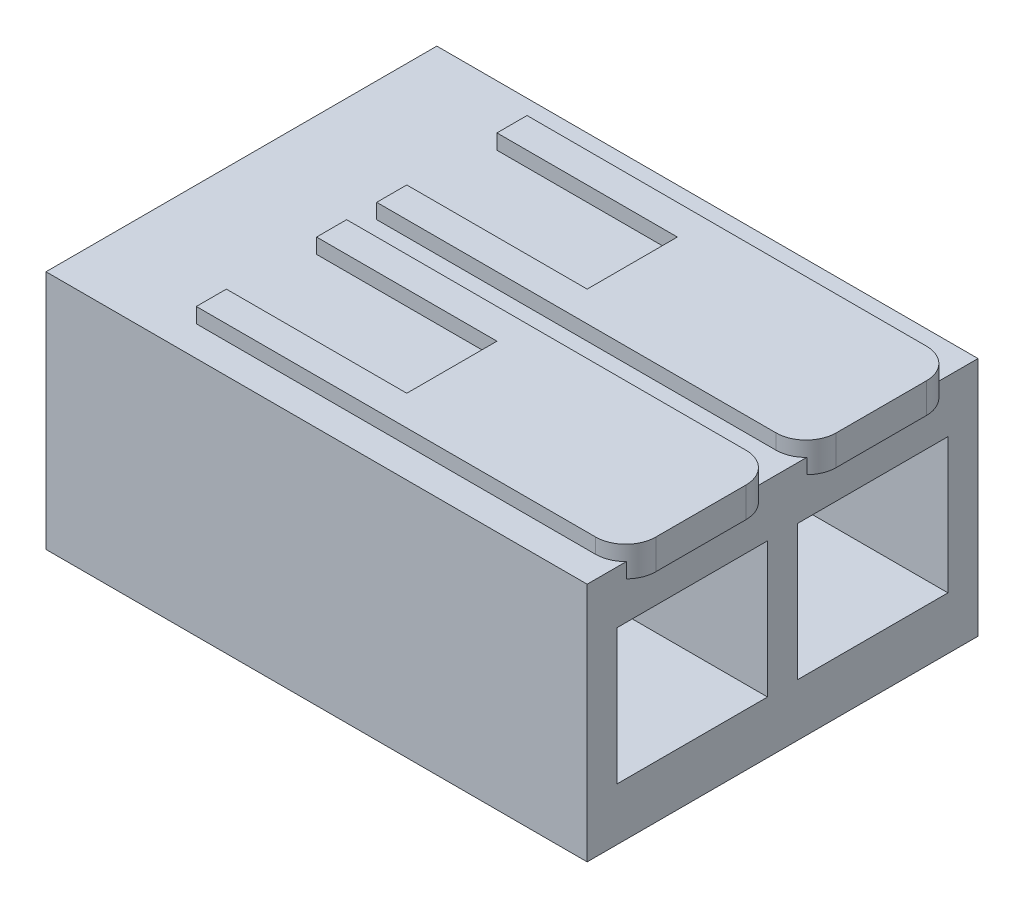
ISO-10303-21;
HEADER;
FILE_DESCRIPTION(('STEP AP214'),'2;1');
FILE_NAME('part.step','',(''),(''),'','','');
FILE_SCHEMA(('AUTOMOTIVE_DESIGN { 1 0 10303 214 1 1 1 1 }'));
ENDSEC;
DATA;
#1=APPLICATION_CONTEXT('core data for automotive mechanical design processes');
#2=APPLICATION_PROTOCOL_DEFINITION('international standard','automotive_design',2000,#1);
#3=PRODUCT_CONTEXT('',#1,'mechanical');
#4=PRODUCT('Part','Part','',(#3));
#5=PRODUCT_RELATED_PRODUCT_CATEGORY('part','',(#4));
#6=PRODUCT_DEFINITION_FORMATION('','',#4);
#7=PRODUCT_DEFINITION_CONTEXT('part definition',#1,'design');
#8=PRODUCT_DEFINITION('design','',#6,#7);
#9=PRODUCT_DEFINITION_SHAPE('','',#8);
#10=(LENGTH_UNIT() NAMED_UNIT(*) SI_UNIT(.MILLI.,.METRE.));
#11=(NAMED_UNIT(*) PLANE_ANGLE_UNIT() SI_UNIT($,.RADIAN.));
#12=(NAMED_UNIT(*) SI_UNIT($,.STERADIAN.) SOLID_ANGLE_UNIT());
#13=UNCERTAINTY_MEASURE_WITH_UNIT(LENGTH_MEASURE(1.E-05),#10,'distance_accuracy_value','');
#14=(GEOMETRIC_REPRESENTATION_CONTEXT(3) GLOBAL_UNCERTAINTY_ASSIGNED_CONTEXT((#13)) GLOBAL_UNIT_ASSIGNED_CONTEXT((#10,
#11,#12)) REPRESENTATION_CONTEXT('',''));
#15=CARTESIAN_POINT('',(0.,0.,0.));
#16=DIRECTION('',(0.,0.,1.));
#17=DIRECTION('',(1.,0.,0.));
#18=AXIS2_PLACEMENT_3D('',#15,#16,#17);
#19=CARTESIAN_POINT('',(4.,8.5,7.));
#20=DIRECTION('',(1.,0.,0.));
#21=DIRECTION('',(0.,1.,0.));
#22=AXIS2_PLACEMENT_3D('',#19,#20,#21);
#23=PLANE('',#22);
#24=DIRECTION('',(0.,0.,1.));
#25=VECTOR('',#24,1.);
#26=CARTESIAN_POINT('',(4.,7.5,7.));
#27=LINE('',#26,#25);
#28=CARTESIAN_POINT('',(4.,7.5,7.));
#29=VERTEX_POINT('',#28);
#30=CARTESIAN_POINT('',(4.,7.5,8.));
#31=VERTEX_POINT('',#30);
#32=EDGE_CURVE('E161',#29,#31,#27,.T.);
#33=ORIENTED_EDGE('',*,*,#32,.T.);
#34=DIRECTION('',(0.,-1.,0.));
#35=VECTOR('',#34,1.);
#36=CARTESIAN_POINT('',(4.,8.5,8.));
#37=LINE('',#36,#35);
#38=CARTESIAN_POINT('',(4.,8.5,8.));
#39=VERTEX_POINT('',#38);
#40=EDGE_CURVE('E12',#39,#31,#37,.T.);
#41=ORIENTED_EDGE('',*,*,#40,.F.);
#42=DIRECTION('',(0.,0.,1.));
#43=VECTOR('',#42,1.);
#44=CARTESIAN_POINT('',(4.,8.5,7.));
#45=LINE('',#44,#43);
#46=CARTESIAN_POINT('',(4.,8.5,7.));
#47=VERTEX_POINT('',#46);
#48=EDGE_CURVE('E179',#47,#39,#45,.T.);
#49=ORIENTED_EDGE('',*,*,#48,.F.);
#50=DIRECTION('',(0.,-1.,0.));
#51=VECTOR('',#50,1.);
#52=CARTESIAN_POINT('',(4.,8.5,7.));
#53=LINE('',#52,#51);
#54=EDGE_CURVE('E157',#47,#29,#53,.T.);
#55=ORIENTED_EDGE('',*,*,#54,.T.);
#56=EDGE_LOOP('',(#33,#41,#49,#55));
#57=FACE_BOUND('',#56,.T.);
#58=ADVANCED_FACE('F53',(#57),#23,.F.);
#59=CARTESIAN_POINT('',(4.,8.5,8.));
#60=DIRECTION('',(0.,0.,-1.));
#61=DIRECTION('',(-1.,0.,0.));
#62=AXIS2_PLACEMENT_3D('',#59,#60,#61);
#63=PLANE('',#62);
#64=DIRECTION('',(1.,0.,0.));
#65=VECTOR('',#64,1.);
#66=CARTESIAN_POINT('',(4.,7.5,8.));
#67=LINE('',#66,#65);
#68=CARTESIAN_POINT('',(10.,7.5,8.));
#69=VERTEX_POINT('',#68);
#70=EDGE_CURVE('E164',#31,#69,#67,.T.);
#71=ORIENTED_EDGE('',*,*,#70,.T.);
#72=DIRECTION('',(0.,-1.,0.));
#73=VECTOR('',#72,1.);
#74=CARTESIAN_POINT('',(10.,8.5,8.));
#75=LINE('',#74,#73);
#76=CARTESIAN_POINT('',(10.,8.5,8.));
#77=VERTEX_POINT('',#76);
#78=EDGE_CURVE('E61',#77,#69,#75,.T.);
#79=ORIENTED_EDGE('',*,*,#78,.F.);
#80=DIRECTION('',(1.,0.,0.));
#81=VECTOR('',#80,1.);
#82=CARTESIAN_POINT('',(4.,8.5,8.));
#83=LINE('',#82,#81);
#84=EDGE_CURVE('E118',#39,#77,#83,.T.);
#85=ORIENTED_EDGE('',*,*,#84,.F.);
#86=ORIENTED_EDGE('',*,*,#40,.T.);
#87=EDGE_LOOP('',(#71,#79,#85,#86));
#88=FACE_BOUND('',#87,.T.);
#89=ADVANCED_FACE('F228',(#88),#63,.F.);
#90=CARTESIAN_POINT('',(10.,8.5,8.));
#91=DIRECTION('',(1.,0.,0.));
#92=DIRECTION('',(0.,1.,0.));
#93=AXIS2_PLACEMENT_3D('',#90,#91,#92);
#94=PLANE('',#93);
#95=DIRECTION('',(0.,0.,1.));
#96=VECTOR('',#95,1.);
#97=CARTESIAN_POINT('',(10.,7.5,8.));
#98=LINE('',#97,#96);
#99=CARTESIAN_POINT('',(10.,7.5,11.));
#100=VERTEX_POINT('',#99);
#101=EDGE_CURVE('E166',#69,#100,#98,.T.);
#102=ORIENTED_EDGE('',*,*,#101,.T.);
#103=DIRECTION('',(0.,-1.,0.));
#104=VECTOR('',#103,1.);
#105=CARTESIAN_POINT('',(10.,8.5,11.));
#106=LINE('',#105,#104);
#107=CARTESIAN_POINT('',(10.,8.5,11.));
#108=VERTEX_POINT('',#107);
#109=EDGE_CURVE('E192',#108,#100,#106,.T.);
#110=ORIENTED_EDGE('',*,*,#109,.F.);
#111=DIRECTION('',(0.,0.,1.));
#112=VECTOR('',#111,1.);
#113=CARTESIAN_POINT('',(10.,8.5,8.));
#114=LINE('',#113,#112);
#115=EDGE_CURVE('E200',#77,#108,#114,.T.);
#116=ORIENTED_EDGE('',*,*,#115,.F.);
#117=ORIENTED_EDGE('',*,*,#78,.T.);
#118=EDGE_LOOP('',(#102,#110,#116,#117));
#119=FACE_BOUND('',#118,.T.);
#120=ADVANCED_FACE('F198',(#119),#94,.F.);
#121=CARTESIAN_POINT('',(10.,8.5,11.));
#122=DIRECTION('',(0.,0.,1.));
#123=DIRECTION('',(1.,0.,0.));
#124=AXIS2_PLACEMENT_3D('',#121,#122,#123);
#125=PLANE('',#124);
#126=DIRECTION('',(-1.,0.,0.));
#127=VECTOR('',#126,1.);
#128=CARTESIAN_POINT('',(10.,7.5,11.));
#129=LINE('',#128,#127);
#130=CARTESIAN_POINT('',(4.,7.5,11.));
#131=VERTEX_POINT('',#130);
#132=EDGE_CURVE('E168',#100,#131,#129,.T.);
#133=ORIENTED_EDGE('',*,*,#132,.T.);
#134=DIRECTION('',(0.,-1.,0.));
#135=VECTOR('',#134,1.);
#136=CARTESIAN_POINT('',(4.,8.5,11.));
#137=LINE('',#136,#135);
#138=CARTESIAN_POINT('',(4.,8.5,11.));
#139=VERTEX_POINT('',#138);
#140=EDGE_CURVE('E189',#139,#131,#137,.T.);
#141=ORIENTED_EDGE('',*,*,#140,.F.);
#142=DIRECTION('',(-1.,0.,0.));
#143=VECTOR('',#142,1.);
#144=CARTESIAN_POINT('',(10.,8.5,11.));
#145=LINE('',#144,#143);
#146=EDGE_CURVE('E218',#108,#139,#145,.T.);
#147=ORIENTED_EDGE('',*,*,#146,.F.);
#148=ORIENTED_EDGE('',*,*,#109,.T.);
#149=EDGE_LOOP('',(#133,#141,#147,#148));
#150=FACE_BOUND('',#149,.T.);
#151=ADVANCED_FACE('F209',(#150),#125,.F.);
#152=CARTESIAN_POINT('',(4.,8.5,11.));
#153=DIRECTION('',(1.,0.,0.));
#154=DIRECTION('',(0.,1.,0.));
#155=AXIS2_PLACEMENT_3D('',#152,#153,#154);
#156=PLANE('',#155);
#157=DIRECTION('',(0.,0.,1.));
#158=VECTOR('',#157,1.);
#159=CARTESIAN_POINT('',(4.,7.5,11.));
#160=LINE('',#159,#158);
#161=CARTESIAN_POINT('',(4.,7.5,12.));
#162=VERTEX_POINT('',#161);
#163=EDGE_CURVE('E170',#131,#162,#160,.T.);
#164=ORIENTED_EDGE('',*,*,#163,.T.);
#165=DIRECTION('',(0.,-1.,0.));
#166=VECTOR('',#165,1.);
#167=CARTESIAN_POINT('',(4.,8.5,12.));
#168=LINE('',#167,#166);
#169=CARTESIAN_POINT('',(4.,8.5,12.));
#170=VERTEX_POINT('',#169);
#171=EDGE_CURVE('E186',#170,#162,#168,.T.);
#172=ORIENTED_EDGE('',*,*,#171,.F.);
#173=DIRECTION('',(0.,0.,1.));
#174=VECTOR('',#173,1.);
#175=CARTESIAN_POINT('',(4.,8.5,11.));
#176=LINE('',#175,#174);
#177=EDGE_CURVE('E215',#139,#170,#176,.T.);
#178=ORIENTED_EDGE('',*,*,#177,.F.);
#179=ORIENTED_EDGE('',*,*,#140,.T.);
#180=EDGE_LOOP('',(#164,#172,#178,#179));
#181=FACE_BOUND('',#180,.T.);
#182=ADVANCED_FACE('F213',(#181),#156,.F.);
#183=CARTESIAN_POINT('',(4.,8.5,12.));
#184=DIRECTION('',(0.,0.,-1.));
#185=DIRECTION('',(-1.,0.,0.));
#186=AXIS2_PLACEMENT_3D('',#183,#184,#185);
#187=PLANE('',#186);
#188=DIRECTION('',(1.,0.,0.));
#189=VECTOR('',#188,1.);
#190=CARTESIAN_POINT('',(4.,7.5,12.));
#191=LINE('',#190,#189);
#192=CARTESIAN_POINT('',(17.2832005913522,7.5,12.));
#193=VERTEX_POINT('',#192);
#194=EDGE_CURVE('E172',#162,#193,#191,.T.);
#195=ORIENTED_EDGE('',*,*,#194,.T.);
#196=DIRECTION('',(0.,-1.,0.));
#197=VECTOR('',#196,1.);
#198=CARTESIAN_POINT('',(17.2832005913522,8.5,12.));
#199=LINE('',#198,#197);
#200=CARTESIAN_POINT('',(17.2832005913522,8.5,12.));
#201=VERTEX_POINT('',#200);
#202=EDGE_CURVE('E183',#201,#193,#199,.T.);
#203=ORIENTED_EDGE('',*,*,#202,.F.);
#204=DIRECTION('',(1.,0.,0.));
#205=VECTOR('',#204,1.);
#206=CARTESIAN_POINT('',(4.,8.5,12.));
#207=LINE('',#206,#205);
#208=EDGE_CURVE('E217',#170,#201,#207,.T.);
#209=ORIENTED_EDGE('',*,*,#208,.F.);
#210=ORIENTED_EDGE('',*,*,#171,.T.);
#211=EDGE_LOOP('',(#195,#203,#209,#210));
#212=FACE_BOUND('',#211,.T.);
#213=ADVANCED_FACE('F240',(#212),#187,.F.);
#214=CARTESIAN_POINT('',(17.2832005913522,8.5,11.));
#215=DIRECTION('',(0.,-1.,0.));
#216=DIRECTION('',(1.,0.,0.));
#217=AXIS2_PLACEMENT_3D('',#214,#215,#216);
#218=CYLINDRICAL_SURFACE('',#217,1.);
#219=CARTESIAN_POINT('',(17.2832005913522,7.5,11.));
#220=DIRECTION('',(0.,1.,0.));
#221=DIRECTION('',(-1.,0.,0.));
#222=AXIS2_PLACEMENT_3D('',#219,#220,#221);
#223=CIRCLE('',#222,1.);
#224=CARTESIAN_POINT('',(18.2832005913522,7.5,11.));
#225=VERTEX_POINT('',#224);
#226=EDGE_CURVE('E174',#193,#225,#223,.T.);
#227=ORIENTED_EDGE('',*,*,#226,.T.);
#228=DIRECTION('',(0.,-1.,0.));
#229=VECTOR('',#228,1.);
#230=CARTESIAN_POINT('',(18.2832005913522,8.5,11.));
#231=LINE('',#230,#229);
#232=CARTESIAN_POINT('',(18.2832005913522,8.5,11.));
#233=VERTEX_POINT('',#232);
#234=EDGE_CURVE('E152',#233,#225,#231,.T.);
#235=ORIENTED_EDGE('',*,*,#234,.F.);
#236=CARTESIAN_POINT('',(17.2832005913522,8.5,11.));
#237=DIRECTION('',(0.,1.,0.));
#238=DIRECTION('',(-1.,0.,0.));
#239=AXIS2_PLACEMENT_3D('',#236,#237,#238);
#240=CIRCLE('',#239,1.);
#241=EDGE_CURVE('E143',#201,#233,#240,.T.);
#242=ORIENTED_EDGE('',*,*,#241,.F.);
#243=ORIENTED_EDGE('',*,*,#202,.T.);
#244=EDGE_LOOP('',(#227,#235,#242,#243));
#245=FACE_BOUND('',#244,.T.);
#246=ADVANCED_FACE('F243',(#245),#218,.T.);
#247=CARTESIAN_POINT('',(18.2832005913522,8.5,8.));
#248=DIRECTION('',(-1.,0.,0.));
#249=DIRECTION('',(0.,0.,1.));
#250=AXIS2_PLACEMENT_3D('',#247,#248,#249);
#251=PLANE('',#250);
#252=DIRECTION('',(0.,0.,-1.));
#253=VECTOR('',#252,1.);
#254=CARTESIAN_POINT('',(18.2832005913522,7.5,8.));
#255=LINE('',#254,#253);
#256=CARTESIAN_POINT('',(18.2832005913522,7.5,8.));
#257=VERTEX_POINT('',#256);
#258=EDGE_CURVE('E151',#225,#257,#255,.T.);
#259=ORIENTED_EDGE('',*,*,#258,.T.);
#260=DIRECTION('',(0.,-1.,0.));
#261=VECTOR('',#260,1.);
#262=CARTESIAN_POINT('',(18.2832005913522,8.5,8.));
#263=LINE('',#262,#261);
#264=CARTESIAN_POINT('',(18.2832005913522,8.5,8.));
#265=VERTEX_POINT('',#264);
#266=EDGE_CURVE('E148',#265,#257,#263,.T.);
#267=ORIENTED_EDGE('',*,*,#266,.F.);
#268=DIRECTION('',(0.,0.,-1.));
#269=VECTOR('',#268,1.);
#270=CARTESIAN_POINT('',(18.2832005913522,8.5,8.));
#271=LINE('',#270,#269);
#272=EDGE_CURVE('E137',#233,#265,#271,.T.);
#273=ORIENTED_EDGE('',*,*,#272,.F.);
#274=ORIENTED_EDGE('',*,*,#234,.T.);
#275=EDGE_LOOP('',(#259,#267,#273,#274));
#276=FACE_BOUND('',#275,.T.);
#277=ADVANCED_FACE('F149',(#276),#251,.F.);
#278=CARTESIAN_POINT('',(17.2832005913522,8.5,8.));
#279=DIRECTION('',(0.,-1.,0.));
#280=DIRECTION('',(1.,0.,0.));
#281=AXIS2_PLACEMENT_3D('',#278,#279,#280);
#282=CYLINDRICAL_SURFACE('',#281,0.999999999999999);
#283=CARTESIAN_POINT('',(17.2832005913522,7.5,8.));
#284=DIRECTION('',(0.,1.,0.));
#285=DIRECTION('',(1.,0.,0.));
#286=AXIS2_PLACEMENT_3D('',#283,#284,#285);
#287=CIRCLE('',#286,0.999999999999999);
#288=CARTESIAN_POINT('',(17.2832005913522,7.5,7.));
#289=VERTEX_POINT('',#288);
#290=EDGE_CURVE('E104',#257,#289,#287,.T.);
#291=ORIENTED_EDGE('',*,*,#290,.T.);
#292=DIRECTION('',(0.,-1.,0.));
#293=VECTOR('',#292,1.);
#294=CARTESIAN_POINT('',(17.2832005913522,8.5,7.));
#295=LINE('',#294,#293);
#296=CARTESIAN_POINT('',(17.2832005913522,8.5,7.));
#297=VERTEX_POINT('',#296);
#298=EDGE_CURVE('E153',#297,#289,#295,.T.);
#299=ORIENTED_EDGE('',*,*,#298,.F.);
#300=CARTESIAN_POINT('',(17.2832005913522,8.5,8.));
#301=DIRECTION('',(0.,1.,0.));
#302=DIRECTION('',(1.,0.,0.));
#303=AXIS2_PLACEMENT_3D('',#300,#301,#302);
#304=CIRCLE('',#303,0.999999999999999);
#305=EDGE_CURVE('E141',#265,#297,#304,.T.);
#306=ORIENTED_EDGE('',*,*,#305,.F.);
#307=ORIENTED_EDGE('',*,*,#266,.T.);
#308=EDGE_LOOP('',(#291,#299,#306,#307));
#309=FACE_BOUND('',#308,.T.);
#310=ADVANCED_FACE('F155',(#309),#282,.T.);
#311=CARTESIAN_POINT('',(4.,8.5,7.));
#312=DIRECTION('',(0.,0.,1.));
#313=DIRECTION('',(1.,0.,0.));
#314=AXIS2_PLACEMENT_3D('',#311,#312,#313);
#315=PLANE('',#314);
#316=DIRECTION('',(-1.,0.,0.));
#317=VECTOR('',#316,1.);
#318=CARTESIAN_POINT('',(4.,7.5,7.));
#319=LINE('',#318,#317);
#320=EDGE_CURVE('E110',#289,#29,#319,.T.);
#321=ORIENTED_EDGE('',*,*,#320,.T.);
#322=ORIENTED_EDGE('',*,*,#54,.F.);
#323=DIRECTION('',(-1.,0.,0.));
#324=VECTOR('',#323,1.);
#325=CARTESIAN_POINT('',(4.,8.5,7.));
#326=LINE('',#325,#324);
#327=EDGE_CURVE('E69',#297,#47,#326,.T.);
#328=ORIENTED_EDGE('',*,*,#327,.F.);
#329=ORIENTED_EDGE('',*,*,#298,.T.);
#330=EDGE_LOOP('',(#321,#322,#328,#329));
#331=FACE_BOUND('',#330,.T.);
#332=ADVANCED_FACE('F252',(#331),#315,.F.);
#333=CARTESIAN_POINT('',(17.2832005913522,8.5,11.));
#334=DIRECTION('',(0.,1.,0.));
#335=DIRECTION('',(-1.,0.,0.));
#336=AXIS2_PLACEMENT_3D('',#333,#334,#335);
#337=PLANE('',#336);
#338=ORIENTED_EDGE('',*,*,#48,.T.);
#339=ORIENTED_EDGE('',*,*,#84,.T.);
#340=ORIENTED_EDGE('',*,*,#115,.T.);
#341=ORIENTED_EDGE('',*,*,#146,.T.);
#342=ORIENTED_EDGE('',*,*,#177,.T.);
#343=ORIENTED_EDGE('',*,*,#208,.T.);
#344=ORIENTED_EDGE('',*,*,#241,.T.);
#345=ORIENTED_EDGE('',*,*,#272,.T.);
#346=ORIENTED_EDGE('',*,*,#305,.T.);
#347=ORIENTED_EDGE('',*,*,#327,.T.);
#348=EDGE_LOOP('',(#338,#339,#340,#341,#342,#343,#344,#345,#346,#347));
#349=FACE_BOUND('',#348,.T.);
#350=ADVANCED_FACE('F139',(#349),#337,.T.);
#351=CARTESIAN_POINT('',(17.2832005913522,7.5,11.));
#352=DIRECTION('',(0.,1.,0.));
#353=DIRECTION('',(-1.,0.,0.));
#354=AXIS2_PLACEMENT_3D('',#351,#352,#353);
#355=PLANE('',#354);
#356=ORIENTED_EDGE('',*,*,#32,.F.);
#357=ORIENTED_EDGE('',*,*,#320,.F.);
#358=ORIENTED_EDGE('',*,*,#290,.F.);
#359=ORIENTED_EDGE('',*,*,#258,.F.);
#360=ORIENTED_EDGE('',*,*,#226,.F.);
#361=ORIENTED_EDGE('',*,*,#194,.F.);
#362=ORIENTED_EDGE('',*,*,#163,.F.);
#363=ORIENTED_EDGE('',*,*,#132,.F.);
#364=ORIENTED_EDGE('',*,*,#101,.F.);
#365=ORIENTED_EDGE('',*,*,#70,.F.);
#366=EDGE_LOOP('',(#356,#357,#358,#359,#360,#361,#362,#363,#364,#365));
#367=FACE_BOUND('',#366,.T.);
#368=ADVANCED_FACE('F204',(#367),#355,.F.);
#369=CLOSED_SHELL('',(#58,#89,#120,#151,#182,#213,#246,#277,#310,#332,#350,#368));
#370=MANIFOLD_SOLID_BREP('B2',#369);
#371=CARTESIAN_POINT('',(4.,8.5,1.));
#372=DIRECTION('',(1.,0.,0.));
#373=DIRECTION('',(0.,1.,0.));
#374=AXIS2_PLACEMENT_3D('',#371,#372,#373);
#375=PLANE('',#374);
#376=DIRECTION('',(0.,0.,1.));
#377=VECTOR('',#376,1.);
#378=CARTESIAN_POINT('',(4.,7.5,1.));
#379=LINE('',#378,#377);
#380=CARTESIAN_POINT('',(4.,7.5,1.));
#381=VERTEX_POINT('',#380);
#382=CARTESIAN_POINT('',(4.,7.5,2.));
#383=VERTEX_POINT('',#382);
#384=EDGE_CURVE('E449',#381,#383,#379,.T.);
#385=ORIENTED_EDGE('',*,*,#384,.T.);
#386=DIRECTION('',(0.,-1.,0.));
#387=VECTOR('',#386,1.);
#388=CARTESIAN_POINT('',(4.,8.5,2.));
#389=LINE('',#388,#387);
#390=CARTESIAN_POINT('',(4.,8.5,2.));
#391=VERTEX_POINT('',#390);
#392=EDGE_CURVE('E51',#391,#383,#389,.T.);
#393=ORIENTED_EDGE('',*,*,#392,.F.);
#394=DIRECTION('',(0.,0.,1.));
#395=VECTOR('',#394,1.);
#396=CARTESIAN_POINT('',(4.,8.5,1.));
#397=LINE('',#396,#395);
#398=CARTESIAN_POINT('',(4.,8.5,1.));
#399=VERTEX_POINT('',#398);
#400=EDGE_CURVE('E467',#399,#391,#397,.T.);
#401=ORIENTED_EDGE('',*,*,#400,.F.);
#402=DIRECTION('',(0.,-1.,0.));
#403=VECTOR('',#402,1.);
#404=CARTESIAN_POINT('',(4.,8.5,1.));
#405=LINE('',#404,#403);
#406=EDGE_CURVE('E445',#399,#381,#405,.T.);
#407=ORIENTED_EDGE('',*,*,#406,.T.);
#408=EDGE_LOOP('',(#385,#393,#401,#407));
#409=FACE_BOUND('',#408,.T.);
#410=ADVANCED_FACE('F341',(#409),#375,.F.);
#411=CARTESIAN_POINT('',(4.,8.5,2.));
#412=DIRECTION('',(0.,0.,-1.));
#413=DIRECTION('',(-1.,0.,0.));
#414=AXIS2_PLACEMENT_3D('',#411,#412,#413);
#415=PLANE('',#414);
#416=DIRECTION('',(1.,0.,0.));
#417=VECTOR('',#416,1.);
#418=CARTESIAN_POINT('',(4.,7.5,2.));
#419=LINE('',#418,#417);
#420=CARTESIAN_POINT('',(10.,7.5,2.));
#421=VERTEX_POINT('',#420);
#422=EDGE_CURVE('E452',#383,#421,#419,.T.);
#423=ORIENTED_EDGE('',*,*,#422,.T.);
#424=DIRECTION('',(0.,-1.,0.));
#425=VECTOR('',#424,1.);
#426=CARTESIAN_POINT('',(10.,8.5,2.));
#427=LINE('',#426,#425);
#428=CARTESIAN_POINT('',(10.,8.5,2.));
#429=VERTEX_POINT('',#428);
#430=EDGE_CURVE('E349',#429,#421,#427,.T.);
#431=ORIENTED_EDGE('',*,*,#430,.F.);
#432=DIRECTION('',(1.,0.,0.));
#433=VECTOR('',#432,1.);
#434=CARTESIAN_POINT('',(4.,8.5,2.));
#435=LINE('',#434,#433);
#436=EDGE_CURVE('E406',#391,#429,#435,.T.);
#437=ORIENTED_EDGE('',*,*,#436,.F.);
#438=ORIENTED_EDGE('',*,*,#392,.T.);
#439=EDGE_LOOP('',(#423,#431,#437,#438));
#440=FACE_BOUND('',#439,.T.);
#441=ADVANCED_FACE('F516',(#440),#415,.F.);
#442=CARTESIAN_POINT('',(10.,8.5,2.));
#443=DIRECTION('',(1.,0.,0.));
#444=DIRECTION('',(0.,0.,-1.));
#445=AXIS2_PLACEMENT_3D('',#442,#443,#444);
#446=PLANE('',#445);
#447=DIRECTION('',(0.,0.,1.));
#448=VECTOR('',#447,1.);
#449=CARTESIAN_POINT('',(10.,7.5,2.));
#450=LINE('',#449,#448);
#451=CARTESIAN_POINT('',(10.,7.5,5.));
#452=VERTEX_POINT('',#451);
#453=EDGE_CURVE('E454',#421,#452,#450,.T.);
#454=ORIENTED_EDGE('',*,*,#453,.T.);
#455=DIRECTION('',(0.,-1.,0.));
#456=VECTOR('',#455,1.);
#457=CARTESIAN_POINT('',(10.,8.5,5.));
#458=LINE('',#457,#456);
#459=CARTESIAN_POINT('',(10.,8.5,5.));
#460=VERTEX_POINT('',#459);
#461=EDGE_CURVE('E480',#460,#452,#458,.T.);
#462=ORIENTED_EDGE('',*,*,#461,.F.);
#463=DIRECTION('',(0.,0.,1.));
#464=VECTOR('',#463,1.);
#465=CARTESIAN_POINT('',(10.,8.5,2.));
#466=LINE('',#465,#464);
#467=EDGE_CURVE('E488',#429,#460,#466,.T.);
#468=ORIENTED_EDGE('',*,*,#467,.F.);
#469=ORIENTED_EDGE('',*,*,#430,.T.);
#470=EDGE_LOOP('',(#454,#462,#468,#469));
#471=FACE_BOUND('',#470,.T.);
#472=ADVANCED_FACE('F486',(#471),#446,.F.);
#473=CARTESIAN_POINT('',(10.,8.5,5.));
#474=DIRECTION('',(0.,0.,1.));
#475=DIRECTION('',(1.,0.,0.));
#476=AXIS2_PLACEMENT_3D('',#473,#474,#475);
#477=PLANE('',#476);
#478=DIRECTION('',(-1.,0.,0.));
#479=VECTOR('',#478,1.);
#480=CARTESIAN_POINT('',(10.,7.5,5.));
#481=LINE('',#480,#479);
#482=CARTESIAN_POINT('',(4.,7.5,5.));
#483=VERTEX_POINT('',#482);
#484=EDGE_CURVE('E456',#452,#483,#481,.T.);
#485=ORIENTED_EDGE('',*,*,#484,.T.);
#486=DIRECTION('',(0.,-1.,0.));
#487=VECTOR('',#486,1.);
#488=CARTESIAN_POINT('',(4.,8.5,5.));
#489=LINE('',#488,#487);
#490=CARTESIAN_POINT('',(4.,8.5,5.));
#491=VERTEX_POINT('',#490);
#492=EDGE_CURVE('E477',#491,#483,#489,.T.);
#493=ORIENTED_EDGE('',*,*,#492,.F.);
#494=DIRECTION('',(-1.,0.,0.));
#495=VECTOR('',#494,1.);
#496=CARTESIAN_POINT('',(10.,8.5,5.));
#497=LINE('',#496,#495);
#498=EDGE_CURVE('E506',#460,#491,#497,.T.);
#499=ORIENTED_EDGE('',*,*,#498,.F.);
#500=ORIENTED_EDGE('',*,*,#461,.T.);
#501=EDGE_LOOP('',(#485,#493,#499,#500));
#502=FACE_BOUND('',#501,.T.);
#503=ADVANCED_FACE('F497',(#502),#477,.F.);
#504=CARTESIAN_POINT('',(4.,8.5,5.));
#505=DIRECTION('',(1.,0.,0.));
#506=DIRECTION('',(0.,0.,-1.));
#507=AXIS2_PLACEMENT_3D('',#504,#505,#506);
#508=PLANE('',#507);
#509=DIRECTION('',(0.,0.,1.));
#510=VECTOR('',#509,1.);
#511=CARTESIAN_POINT('',(4.,7.5,5.));
#512=LINE('',#511,#510);
#513=CARTESIAN_POINT('',(4.,7.5,6.));
#514=VERTEX_POINT('',#513);
#515=EDGE_CURVE('E458',#483,#514,#512,.T.);
#516=ORIENTED_EDGE('',*,*,#515,.T.);
#517=DIRECTION('',(0.,-1.,0.));
#518=VECTOR('',#517,1.);
#519=CARTESIAN_POINT('',(4.,8.5,6.));
#520=LINE('',#519,#518);
#521=CARTESIAN_POINT('',(4.,8.5,6.));
#522=VERTEX_POINT('',#521);
#523=EDGE_CURVE('E474',#522,#514,#520,.T.);
#524=ORIENTED_EDGE('',*,*,#523,.F.);
#525=DIRECTION('',(0.,0.,1.));
#526=VECTOR('',#525,1.);
#527=CARTESIAN_POINT('',(4.,8.5,5.));
#528=LINE('',#527,#526);
#529=EDGE_CURVE('E503',#491,#522,#528,.T.);
#530=ORIENTED_EDGE('',*,*,#529,.F.);
#531=ORIENTED_EDGE('',*,*,#492,.T.);
#532=EDGE_LOOP('',(#516,#524,#530,#531));
#533=FACE_BOUND('',#532,.T.);
#534=ADVANCED_FACE('F501',(#533),#508,.F.);
#535=CARTESIAN_POINT('',(4.,8.5,6.));
#536=DIRECTION('',(0.,0.,-1.));
#537=DIRECTION('',(-1.,0.,0.));
#538=AXIS2_PLACEMENT_3D('',#535,#536,#537);
#539=PLANE('',#538);
#540=DIRECTION('',(1.,0.,0.));
#541=VECTOR('',#540,1.);
#542=CARTESIAN_POINT('',(4.,7.5,6.));
#543=LINE('',#542,#541);
#544=CARTESIAN_POINT('',(17.2832005913522,7.5,6.));
#545=VERTEX_POINT('',#544);
#546=EDGE_CURVE('E460',#514,#545,#543,.T.);
#547=ORIENTED_EDGE('',*,*,#546,.T.);
#548=DIRECTION('',(0.,-1.,0.));
#549=VECTOR('',#548,1.);
#550=CARTESIAN_POINT('',(17.2832005913522,8.5,6.));
#551=LINE('',#550,#549);
#552=CARTESIAN_POINT('',(17.2832005913522,8.5,6.));
#553=VERTEX_POINT('',#552);
#554=EDGE_CURVE('E471',#553,#545,#551,.T.);
#555=ORIENTED_EDGE('',*,*,#554,.F.);
#556=DIRECTION('',(1.,0.,0.));
#557=VECTOR('',#556,1.);
#558=CARTESIAN_POINT('',(4.,8.5,6.));
#559=LINE('',#558,#557);
#560=EDGE_CURVE('E505',#522,#553,#559,.T.);
#561=ORIENTED_EDGE('',*,*,#560,.F.);
#562=ORIENTED_EDGE('',*,*,#523,.T.);
#563=EDGE_LOOP('',(#547,#555,#561,#562));
#564=FACE_BOUND('',#563,.T.);
#565=ADVANCED_FACE('F528',(#564),#539,.F.);
#566=CARTESIAN_POINT('',(17.2832005913522,8.5,5.));
#567=DIRECTION('',(0.,-1.,0.));
#568=DIRECTION('',(1.,0.,0.));
#569=AXIS2_PLACEMENT_3D('',#566,#567,#568);
#570=CYLINDRICAL_SURFACE('',#569,0.999999999999998);
#571=CARTESIAN_POINT('',(17.2832005913522,7.5,5.));
#572=DIRECTION('',(0.,1.,0.));
#573=DIRECTION('',(-1.,0.,0.));
#574=AXIS2_PLACEMENT_3D('',#571,#572,#573);
#575=CIRCLE('',#574,0.999999999999998);
#576=CARTESIAN_POINT('',(18.2832005913522,7.5,5.));
#577=VERTEX_POINT('',#576);
#578=EDGE_CURVE('E462',#545,#577,#575,.T.);
#579=ORIENTED_EDGE('',*,*,#578,.T.);
#580=DIRECTION('',(0.,-1.,0.));
#581=VECTOR('',#580,1.);
#582=CARTESIAN_POINT('',(18.2832005913522,8.5,5.));
#583=LINE('',#582,#581);
#584=CARTESIAN_POINT('',(18.2832005913522,8.5,5.));
#585=VERTEX_POINT('',#584);
#586=EDGE_CURVE('E440',#585,#577,#583,.T.);
#587=ORIENTED_EDGE('',*,*,#586,.F.);
#588=CARTESIAN_POINT('',(17.2832005913522,8.5,5.));
#589=DIRECTION('',(0.,1.,0.));
#590=DIRECTION('',(-1.,0.,0.));
#591=AXIS2_PLACEMENT_3D('',#588,#589,#590);
#592=CIRCLE('',#591,0.999999999999998);
#593=EDGE_CURVE('E431',#553,#585,#592,.T.);
#594=ORIENTED_EDGE('',*,*,#593,.F.);
#595=ORIENTED_EDGE('',*,*,#554,.T.);
#596=EDGE_LOOP('',(#579,#587,#594,#595));
#597=FACE_BOUND('',#596,.T.);
#598=ADVANCED_FACE('F531',(#597),#570,.T.);
#599=CARTESIAN_POINT('',(18.2832005913522,8.5,2.));
#600=DIRECTION('',(-1.,0.,0.));
#601=DIRECTION('',(0.,-1.,0.));
#602=AXIS2_PLACEMENT_3D('',#599,#600,#601);
#603=PLANE('',#602);
#604=DIRECTION('',(0.,0.,-1.));
#605=VECTOR('',#604,1.);
#606=CARTESIAN_POINT('',(18.2832005913522,7.5,2.));
#607=LINE('',#606,#605);
#608=CARTESIAN_POINT('',(18.2832005913522,7.5,2.));
#609=VERTEX_POINT('',#608);
#610=EDGE_CURVE('E439',#577,#609,#607,.T.);
#611=ORIENTED_EDGE('',*,*,#610,.T.);
#612=DIRECTION('',(0.,-1.,0.));
#613=VECTOR('',#612,1.);
#614=CARTESIAN_POINT('',(18.2832005913522,8.5,2.));
#615=LINE('',#614,#613);
#616=CARTESIAN_POINT('',(18.2832005913522,8.5,2.));
#617=VERTEX_POINT('',#616);
#618=EDGE_CURVE('E436',#617,#609,#615,.T.);
#619=ORIENTED_EDGE('',*,*,#618,.F.);
#620=DIRECTION('',(0.,0.,-1.));
#621=VECTOR('',#620,1.);
#622=CARTESIAN_POINT('',(18.2832005913522,8.5,2.));
#623=LINE('',#622,#621);
#624=EDGE_CURVE('E425',#585,#617,#623,.T.);
#625=ORIENTED_EDGE('',*,*,#624,.F.);
#626=ORIENTED_EDGE('',*,*,#586,.T.);
#627=EDGE_LOOP('',(#611,#619,#625,#626));
#628=FACE_BOUND('',#627,.T.);
#629=ADVANCED_FACE('F437',(#628),#603,.F.);
#630=CARTESIAN_POINT('',(17.2832005913522,8.5,2.));
#631=DIRECTION('',(0.,-1.,0.));
#632=DIRECTION('',(1.,0.,0.));
#633=AXIS2_PLACEMENT_3D('',#630,#631,#632);
#634=CYLINDRICAL_SURFACE('',#633,0.999999999999999);
#635=CARTESIAN_POINT('',(17.2832005913522,7.5,2.));
#636=DIRECTION('',(0.,1.,0.));
#637=DIRECTION('',(1.,0.,0.));
#638=AXIS2_PLACEMENT_3D('',#635,#636,#637);
#639=CIRCLE('',#638,0.999999999999999);
#640=CARTESIAN_POINT('',(17.2832005913522,7.5,1.));
#641=VERTEX_POINT('',#640);
#642=EDGE_CURVE('E392',#609,#641,#639,.T.);
#643=ORIENTED_EDGE('',*,*,#642,.T.);
#644=DIRECTION('',(0.,-1.,0.));
#645=VECTOR('',#644,1.);
#646=CARTESIAN_POINT('',(17.2832005913522,8.5,1.));
#647=LINE('',#646,#645);
#648=CARTESIAN_POINT('',(17.2832005913522,8.5,1.));
#649=VERTEX_POINT('',#648);
#650=EDGE_CURVE('E441',#649,#641,#647,.T.);
#651=ORIENTED_EDGE('',*,*,#650,.F.);
#652=CARTESIAN_POINT('',(17.2832005913522,8.5,2.));
#653=DIRECTION('',(0.,1.,0.));
#654=DIRECTION('',(1.,0.,0.));
#655=AXIS2_PLACEMENT_3D('',#652,#653,#654);
#656=CIRCLE('',#655,0.999999999999999);
#657=EDGE_CURVE('E429',#617,#649,#656,.T.);
#658=ORIENTED_EDGE('',*,*,#657,.F.);
#659=ORIENTED_EDGE('',*,*,#618,.T.);
#660=EDGE_LOOP('',(#643,#651,#658,#659));
#661=FACE_BOUND('',#660,.T.);
#662=ADVANCED_FACE('F443',(#661),#634,.T.);
#663=CARTESIAN_POINT('',(4.,8.5,1.));
#664=DIRECTION('',(0.,0.,1.));
#665=DIRECTION('',(1.,0.,0.));
#666=AXIS2_PLACEMENT_3D('',#663,#664,#665);
#667=PLANE('',#666);
#668=DIRECTION('',(-1.,0.,0.));
#669=VECTOR('',#668,1.);
#670=CARTESIAN_POINT('',(4.,7.5,1.));
#671=LINE('',#670,#669);
#672=EDGE_CURVE('E398',#641,#381,#671,.T.);
#673=ORIENTED_EDGE('',*,*,#672,.T.);
#674=ORIENTED_EDGE('',*,*,#406,.F.);
#675=DIRECTION('',(-1.,0.,0.));
#676=VECTOR('',#675,1.);
#677=CARTESIAN_POINT('',(4.,8.5,1.));
#678=LINE('',#677,#676);
#679=EDGE_CURVE('E357',#649,#399,#678,.T.);
#680=ORIENTED_EDGE('',*,*,#679,.F.);
#681=ORIENTED_EDGE('',*,*,#650,.T.);
#682=EDGE_LOOP('',(#673,#674,#680,#681));
#683=FACE_BOUND('',#682,.T.);
#684=ADVANCED_FACE('F540',(#683),#667,.F.);
#685=CARTESIAN_POINT('',(17.2832005913522,8.5,5.));
#686=DIRECTION('',(0.,1.,0.));
#687=DIRECTION('',(-1.,0.,0.));
#688=AXIS2_PLACEMENT_3D('',#685,#686,#687);
#689=PLANE('',#688);
#690=ORIENTED_EDGE('',*,*,#400,.T.);
#691=ORIENTED_EDGE('',*,*,#436,.T.);
#692=ORIENTED_EDGE('',*,*,#467,.T.);
#693=ORIENTED_EDGE('',*,*,#498,.T.);
#694=ORIENTED_EDGE('',*,*,#529,.T.);
#695=ORIENTED_EDGE('',*,*,#560,.T.);
#696=ORIENTED_EDGE('',*,*,#593,.T.);
#697=ORIENTED_EDGE('',*,*,#624,.T.);
#698=ORIENTED_EDGE('',*,*,#657,.T.);
#699=ORIENTED_EDGE('',*,*,#679,.T.);
#700=EDGE_LOOP('',(#690,#691,#692,#693,#694,#695,#696,#697,#698,#699));
#701=FACE_BOUND('',#700,.T.);
#702=ADVANCED_FACE('F427',(#701),#689,.T.);
#703=CARTESIAN_POINT('',(17.2832005913522,7.5,5.));
#704=DIRECTION('',(0.,1.,0.));
#705=DIRECTION('',(-1.,0.,0.));
#706=AXIS2_PLACEMENT_3D('',#703,#704,#705);
#707=PLANE('',#706);
#708=ORIENTED_EDGE('',*,*,#384,.F.);
#709=ORIENTED_EDGE('',*,*,#672,.F.);
#710=ORIENTED_EDGE('',*,*,#642,.F.);
#711=ORIENTED_EDGE('',*,*,#610,.F.);
#712=ORIENTED_EDGE('',*,*,#578,.F.);
#713=ORIENTED_EDGE('',*,*,#546,.F.);
#714=ORIENTED_EDGE('',*,*,#515,.F.);
#715=ORIENTED_EDGE('',*,*,#484,.F.);
#716=ORIENTED_EDGE('',*,*,#453,.F.);
#717=ORIENTED_EDGE('',*,*,#422,.F.);
#718=EDGE_LOOP('',(#708,#709,#710,#711,#712,#713,#714,#715,#716,#717));
#719=FACE_BOUND('',#718,.T.);
#720=ADVANCED_FACE('F492',(#719),#707,.F.);
#721=CLOSED_SHELL('',(#410,#441,#472,#503,#534,#565,#598,#629,#662,#684,#702,#720));
#722=MANIFOLD_SOLID_BREP('B6',#721);
#723=CARTESIAN_POINT('',(0.,0.,13.));
#724=DIRECTION('',(0.,1.,0.));
#725=DIRECTION('',(0.,0.,1.));
#726=AXIS2_PLACEMENT_3D('',#723,#724,#725);
#727=PLANE('',#726);
#728=DIRECTION('',(1.,0.,0.));
#729=VECTOR('',#728,1.);
#730=CARTESIAN_POINT('',(0.,0.,0.));
#731=LINE('',#730,#729);
#732=CARTESIAN_POINT('',(0.,0.,0.));
#733=VERTEX_POINT('',#732);
#734=CARTESIAN_POINT('',(18.,0.,0.));
#735=VERTEX_POINT('',#734);
#736=EDGE_CURVE('E771',#733,#735,#731,.T.);
#737=ORIENTED_EDGE('',*,*,#736,.T.);
#738=DIRECTION('',(0.,0.,-1.));
#739=VECTOR('',#738,1.);
#740=CARTESIAN_POINT('',(18.,0.,13.));
#741=LINE('',#740,#739);
#742=CARTESIAN_POINT('',(18.,0.,13.));
#743=VERTEX_POINT('',#742);
#744=EDGE_CURVE('E627',#743,#735,#741,.T.);
#745=ORIENTED_EDGE('',*,*,#744,.F.);
#746=DIRECTION('',(1.,0.,0.));
#747=VECTOR('',#746,1.);
#748=CARTESIAN_POINT('',(0.,0.,13.));
#749=LINE('',#748,#747);
#750=CARTESIAN_POINT('',(0.,0.,13.));
#751=VERTEX_POINT('',#750);
#752=EDGE_CURVE('E780',#751,#743,#749,.T.);
#753=ORIENTED_EDGE('',*,*,#752,.F.);
#754=DIRECTION('',(0.,0.,-1.));
#755=VECTOR('',#754,1.);
#756=CARTESIAN_POINT('',(0.,0.,13.));
#757=LINE('',#756,#755);
#758=EDGE_CURVE('E339',#751,#733,#757,.T.);
#759=ORIENTED_EDGE('',*,*,#758,.T.);
#760=EDGE_LOOP('',(#737,#745,#753,#759));
#761=FACE_BOUND('',#760,.T.);
#762=ADVANCED_FACE('F620',(#761),#727,.F.);
#763=CARTESIAN_POINT('',(18.,0.,13.));
#764=DIRECTION('',(-1.,0.,0.));
#765=DIRECTION('',(0.,0.,1.));
#766=AXIS2_PLACEMENT_3D('',#763,#764,#765);
#767=PLANE('',#766);
#768=DIRECTION('',(0.,0.,-1.));
#769=VECTOR('',#768,1.);
#770=CARTESIAN_POINT('',(18.,1.75,12.));
#771=LINE('',#770,#769);
#772=CARTESIAN_POINT('',(18.,1.75,12.));
#773=VERTEX_POINT('',#772);
#774=CARTESIAN_POINT('',(18.,1.75,7.));
#775=VERTEX_POINT('',#774);
#776=EDGE_CURVE('E737',#773,#775,#771,.T.);
#777=ORIENTED_EDGE('',*,*,#776,.F.);
#778=DIRECTION('',(0.,-1.,0.));
#779=VECTOR('',#778,1.);
#780=CARTESIAN_POINT('',(18.,6.25,12.));
#781=LINE('',#780,#779);
#782=CARTESIAN_POINT('',(18.,6.25,12.));
#783=VERTEX_POINT('',#782);
#784=EDGE_CURVE('E634',#783,#773,#781,.T.);
#785=ORIENTED_EDGE('',*,*,#784,.F.);
#786=DIRECTION('',(0.,0.,1.));
#787=VECTOR('',#786,1.);
#788=CARTESIAN_POINT('',(18.,6.25,12.));
#789=LINE('',#788,#787);
#790=CARTESIAN_POINT('',(18.,6.25,7.));
#791=VERTEX_POINT('',#790);
#792=EDGE_CURVE('E728',#791,#783,#789,.T.);
#793=ORIENTED_EDGE('',*,*,#792,.F.);
#794=DIRECTION('',(0.,1.,0.));
#795=VECTOR('',#794,1.);
#796=CARTESIAN_POINT('',(18.,6.25,7.));
#797=LINE('',#796,#795);
#798=EDGE_CURVE('E731',#775,#791,#797,.T.);
#799=ORIENTED_EDGE('',*,*,#798,.F.);
#800=EDGE_LOOP('',(#777,#785,#793,#799));
#801=FACE_BOUND('',#800,.T.);
#802=DIRECTION('',(0.,0.,-1.));
#803=VECTOR('',#802,1.);
#804=CARTESIAN_POINT('',(18.,1.75,6.));
#805=LINE('',#804,#803);
#806=CARTESIAN_POINT('',(18.,1.75,6.));
#807=VERTEX_POINT('',#806);
#808=CARTESIAN_POINT('',(18.,1.75,1.));
#809=VERTEX_POINT('',#808);
#810=EDGE_CURVE('E761',#807,#809,#805,.T.);
#811=ORIENTED_EDGE('',*,*,#810,.F.);
#812=DIRECTION('',(0.,-1.,0.));
#813=VECTOR('',#812,1.);
#814=CARTESIAN_POINT('',(18.,6.25,6.));
#815=LINE('',#814,#813);
#816=CARTESIAN_POINT('',(18.,6.25,6.));
#817=VERTEX_POINT('',#816);
#818=EDGE_CURVE('E642',#817,#807,#815,.T.);
#819=ORIENTED_EDGE('',*,*,#818,.F.);
#820=DIRECTION('',(0.,0.,1.));
#821=VECTOR('',#820,1.);
#822=CARTESIAN_POINT('',(18.,6.25,6.));
#823=LINE('',#822,#821);
#824=CARTESIAN_POINT('',(18.,6.25,1.));
#825=VERTEX_POINT('',#824);
#826=EDGE_CURVE('E750',#825,#817,#823,.T.);
#827=ORIENTED_EDGE('',*,*,#826,.F.);
#828=DIRECTION('',(0.,1.,0.));
#829=VECTOR('',#828,1.);
#830=CARTESIAN_POINT('',(18.,6.25,1.));
#831=LINE('',#830,#829);
#832=EDGE_CURVE('E764',#809,#825,#831,.T.);
#833=ORIENTED_EDGE('',*,*,#832,.F.);
#834=EDGE_LOOP('',(#811,#819,#827,#833));
#835=FACE_BOUND('',#834,.T.);
#836=DIRECTION('',(0.,1.,0.));
#837=VECTOR('',#836,1.);
#838=CARTESIAN_POINT('',(18.,0.,0.));
#839=LINE('',#838,#837);
#840=CARTESIAN_POINT('',(18.,8.,0.));
#841=VERTEX_POINT('',#840);
#842=EDGE_CURVE('E790',#735,#841,#839,.T.);
#843=ORIENTED_EDGE('',*,*,#842,.T.);
#844=DIRECTION('',(0.,0.,-1.));
#845=VECTOR('',#844,1.);
#846=CARTESIAN_POINT('',(18.,8.,13.));
#847=LINE('',#846,#845);
#848=CARTESIAN_POINT('',(18.,8.,13.));
#849=VERTEX_POINT('',#848);
#850=EDGE_CURVE('E797',#849,#841,#847,.T.);
#851=ORIENTED_EDGE('',*,*,#850,.F.);
#852=DIRECTION('',(0.,1.,0.));
#853=VECTOR('',#852,1.);
#854=CARTESIAN_POINT('',(18.,0.,13.));
#855=LINE('',#854,#853);
#856=EDGE_CURVE('E783',#743,#849,#855,.T.);
#857=ORIENTED_EDGE('',*,*,#856,.F.);
#858=ORIENTED_EDGE('',*,*,#744,.T.);
#859=EDGE_LOOP('',(#843,#851,#857,#858));
#860=FACE_BOUND('',#859,.T.);
#861=ADVANCED_FACE('F804',(#801,#835,#860),#767,.F.);
#862=CARTESIAN_POINT('',(18.,8.,13.));
#863=DIRECTION('',(0.,-1.,0.));
#864=DIRECTION('',(1.,0.,0.));
#865=AXIS2_PLACEMENT_3D('',#862,#863,#864);
#866=PLANE('',#865);
#867=DIRECTION('',(-1.,0.,0.));
#868=VECTOR('',#867,1.);
#869=CARTESIAN_POINT('',(18.,8.,0.));
#870=LINE('',#869,#868);
#871=CARTESIAN_POINT('',(0.,8.,0.));
#872=VERTEX_POINT('',#871);
#873=EDGE_CURVE('E792',#841,#872,#870,.T.);
#874=ORIENTED_EDGE('',*,*,#873,.T.);
#875=DIRECTION('',(0.,0.,-1.));
#876=VECTOR('',#875,1.);
#877=CARTESIAN_POINT('',(0.,8.,13.));
#878=LINE('',#877,#876);
#879=CARTESIAN_POINT('',(0.,8.,13.));
#880=VERTEX_POINT('',#879);
#881=EDGE_CURVE('E788',#880,#872,#878,.T.);
#882=ORIENTED_EDGE('',*,*,#881,.F.);
#883=DIRECTION('',(-1.,0.,0.));
#884=VECTOR('',#883,1.);
#885=CARTESIAN_POINT('',(18.,8.,13.));
#886=LINE('',#885,#884);
#887=EDGE_CURVE('E785',#849,#880,#886,.T.);
#888=ORIENTED_EDGE('',*,*,#887,.F.);
#889=ORIENTED_EDGE('',*,*,#850,.T.);
#890=EDGE_LOOP('',(#874,#882,#888,#889));
#891=FACE_BOUND('',#890,.T.);
#892=ADVANCED_FACE('F814',(#891),#866,.F.);
#893=CARTESIAN_POINT('',(0.,4.,13.));
#894=DIRECTION('',(1.,0.,0.));
#895=DIRECTION('',(0.,0.,-1.));
#896=AXIS2_PLACEMENT_3D('',#893,#894,#895);
#897=PLANE('',#896);
#898=DIRECTION('',(0.,-1.,0.));
#899=VECTOR('',#898,1.);
#900=CARTESIAN_POINT('',(0.,4.,0.));
#901=LINE('',#900,#899);
#902=EDGE_CURVE('E781',#872,#733,#901,.T.);
#903=ORIENTED_EDGE('',*,*,#902,.T.);
#904=ORIENTED_EDGE('',*,*,#758,.F.);
#905=DIRECTION('',(0.,-1.,0.));
#906=VECTOR('',#905,1.);
#907=CARTESIAN_POINT('',(0.,0.,13.));
#908=LINE('',#907,#906);
#909=EDGE_CURVE('E777',#880,#751,#908,.T.);
#910=ORIENTED_EDGE('',*,*,#909,.F.);
#911=ORIENTED_EDGE('',*,*,#881,.T.);
#912=EDGE_LOOP('',(#903,#904,#910,#911));
#913=FACE_BOUND('',#912,.T.);
#914=ADVANCED_FACE('F817',(#913),#897,.F.);
#915=CARTESIAN_POINT('',(0.,0.,13.));
#916=DIRECTION('',(0.,0.,1.));
#917=DIRECTION('',(1.,0.,0.));
#918=AXIS2_PLACEMENT_3D('',#915,#916,#917);
#919=PLANE('',#918);
#920=ORIENTED_EDGE('',*,*,#909,.T.);
#921=ORIENTED_EDGE('',*,*,#752,.T.);
#922=ORIENTED_EDGE('',*,*,#856,.T.);
#923=ORIENTED_EDGE('',*,*,#887,.T.);
#924=EDGE_LOOP('',(#920,#921,#922,#923));
#925=FACE_BOUND('',#924,.T.);
#926=ADVANCED_FACE('F820',(#925),#919,.T.);
#927=CARTESIAN_POINT('',(0.,0.,0.));
#928=DIRECTION('',(0.,0.,1.));
#929=DIRECTION('',(1.,0.,0.));
#930=AXIS2_PLACEMENT_3D('',#927,#928,#929);
#931=PLANE('',#930);
#932=ORIENTED_EDGE('',*,*,#736,.F.);
#933=ORIENTED_EDGE('',*,*,#902,.F.);
#934=ORIENTED_EDGE('',*,*,#873,.F.);
#935=ORIENTED_EDGE('',*,*,#842,.F.);
#936=EDGE_LOOP('',(#932,#933,#934,#935));
#937=FACE_BOUND('',#936,.T.);
#938=ADVANCED_FACE('F810',(#937),#931,.F.);
#939=CARTESIAN_POINT('',(13.,6.25,6.));
#940=DIRECTION('',(0.,0.,1.));
#941=DIRECTION('',(1.,0.,0.));
#942=AXIS2_PLACEMENT_3D('',#939,#940,#941);
#943=PLANE('',#942);
#944=ORIENTED_EDGE('',*,*,#818,.T.);
#945=DIRECTION('',(1.,0.,0.));
#946=VECTOR('',#945,1.);
#947=CARTESIAN_POINT('',(13.,1.75,6.));
#948=LINE('',#947,#946);
#949=CARTESIAN_POINT('',(13.,1.75,6.));
#950=VERTEX_POINT('',#949);
#951=EDGE_CURVE('E759',#950,#807,#948,.T.);
#952=ORIENTED_EDGE('',*,*,#951,.F.);
#953=DIRECTION('',(0.,-1.,0.));
#954=VECTOR('',#953,1.);
#955=CARTESIAN_POINT('',(13.,6.25,6.));
#956=LINE('',#955,#954);
#957=CARTESIAN_POINT('',(13.,6.25,6.));
#958=VERTEX_POINT('',#957);
#959=EDGE_CURVE('E746',#958,#950,#956,.T.);
#960=ORIENTED_EDGE('',*,*,#959,.F.);
#961=DIRECTION('',(1.,0.,0.));
#962=VECTOR('',#961,1.);
#963=CARTESIAN_POINT('',(13.,6.25,6.));
#964=LINE('',#963,#962);
#965=EDGE_CURVE('E769',#958,#817,#964,.T.);
#966=ORIENTED_EDGE('',*,*,#965,.T.);
#967=EDGE_LOOP('',(#944,#952,#960,#966));
#968=FACE_BOUND('',#967,.T.);
#969=ADVANCED_FACE('F836',(#968),#943,.F.);
#970=CARTESIAN_POINT('',(13.,6.25,6.));
#971=DIRECTION('',(0.,1.,0.));
#972=DIRECTION('',(0.,0.,1.));
#973=AXIS2_PLACEMENT_3D('',#970,#971,#972);
#974=PLANE('',#973);
#975=ORIENTED_EDGE('',*,*,#826,.T.);
#976=ORIENTED_EDGE('',*,*,#965,.F.);
#977=DIRECTION('',(0.,0.,1.));
#978=VECTOR('',#977,1.);
#979=CARTESIAN_POINT('',(13.,6.25,6.));
#980=LINE('',#979,#978);
#981=CARTESIAN_POINT('',(13.,6.25,1.));
#982=VERTEX_POINT('',#981);
#983=EDGE_CURVE('E756',#982,#958,#980,.T.);
#984=ORIENTED_EDGE('',*,*,#983,.F.);
#985=DIRECTION('',(1.,0.,0.));
#986=VECTOR('',#985,1.);
#987=CARTESIAN_POINT('',(13.,6.25,1.));
#988=LINE('',#987,#986);
#989=EDGE_CURVE('E772',#982,#825,#988,.T.);
#990=ORIENTED_EDGE('',*,*,#989,.T.);
#991=EDGE_LOOP('',(#975,#976,#984,#990));
#992=FACE_BOUND('',#991,.T.);
#993=ADVANCED_FACE('F841',(#992),#974,.F.);
#994=CARTESIAN_POINT('',(13.,6.25,1.));
#995=DIRECTION('',(0.,0.,-1.));
#996=DIRECTION('',(-1.,0.,0.));
#997=AXIS2_PLACEMENT_3D('',#994,#995,#996);
#998=PLANE('',#997);
#999=ORIENTED_EDGE('',*,*,#832,.T.);
#1000=ORIENTED_EDGE('',*,*,#989,.F.);
#1001=DIRECTION('',(0.,1.,0.));
#1002=VECTOR('',#1001,1.);
#1003=CARTESIAN_POINT('',(13.,6.25,1.));
#1004=LINE('',#1003,#1002);
#1005=CARTESIAN_POINT('',(13.,1.75,1.));
#1006=VERTEX_POINT('',#1005);
#1007=EDGE_CURVE('E753',#1006,#982,#1004,.T.);
#1008=ORIENTED_EDGE('',*,*,#1007,.F.);
#1009=DIRECTION('',(1.,0.,0.));
#1010=VECTOR('',#1009,1.);
#1011=CARTESIAN_POINT('',(13.,1.75,1.));
#1012=LINE('',#1011,#1010);
#1013=EDGE_CURVE('E774',#1006,#809,#1012,.T.);
#1014=ORIENTED_EDGE('',*,*,#1013,.T.);
#1015=EDGE_LOOP('',(#999,#1000,#1008,#1014));
#1016=FACE_BOUND('',#1015,.T.);
#1017=ADVANCED_FACE('F846',(#1016),#998,.F.);
#1018=CARTESIAN_POINT('',(13.,1.75,6.));
#1019=DIRECTION('',(0.,-1.,0.));
#1020=DIRECTION('',(0.,0.,-1.));
#1021=AXIS2_PLACEMENT_3D('',#1018,#1019,#1020);
#1022=PLANE('',#1021);
#1023=ORIENTED_EDGE('',*,*,#810,.T.);
#1024=ORIENTED_EDGE('',*,*,#1013,.F.);
#1025=DIRECTION('',(0.,0.,-1.));
#1026=VECTOR('',#1025,1.);
#1027=CARTESIAN_POINT('',(13.,1.75,6.));
#1028=LINE('',#1027,#1026);
#1029=EDGE_CURVE('E749',#950,#1006,#1028,.T.);
#1030=ORIENTED_EDGE('',*,*,#1029,.F.);
#1031=ORIENTED_EDGE('',*,*,#951,.T.);
#1032=EDGE_LOOP('',(#1023,#1024,#1030,#1031));
#1033=FACE_BOUND('',#1032,.T.);
#1034=ADVANCED_FACE('F842',(#1033),#1022,.F.);
#1035=CARTESIAN_POINT('',(13.,0.,0.));
#1036=DIRECTION('',(1.,0.,0.));
#1037=DIRECTION('',(0.,0.,-1.));
#1038=AXIS2_PLACEMENT_3D('',#1035,#1036,#1037);
#1039=PLANE('',#1038);
#1040=ORIENTED_EDGE('',*,*,#959,.T.);
#1041=ORIENTED_EDGE('',*,*,#1029,.T.);
#1042=ORIENTED_EDGE('',*,*,#1007,.T.);
#1043=ORIENTED_EDGE('',*,*,#983,.T.);
#1044=EDGE_LOOP('',(#1040,#1041,#1042,#1043));
#1045=FACE_BOUND('',#1044,.T.);
#1046=ADVANCED_FACE('F845',(#1045),#1039,.T.);
#1047=CARTESIAN_POINT('',(13.,6.25,12.));
#1048=DIRECTION('',(0.,0.,1.));
#1049=DIRECTION('',(1.,0.,0.));
#1050=AXIS2_PLACEMENT_3D('',#1047,#1048,#1049);
#1051=PLANE('',#1050);
#1052=ORIENTED_EDGE('',*,*,#784,.T.);
#1053=DIRECTION('',(1.,0.,0.));
#1054=VECTOR('',#1053,1.);
#1055=CARTESIAN_POINT('',(13.,1.75,12.));
#1056=LINE('',#1055,#1054);
#1057=CARTESIAN_POINT('',(13.,1.75,12.));
#1058=VERTEX_POINT('',#1057);
#1059=EDGE_CURVE('E706',#1058,#773,#1056,.T.);
#1060=ORIENTED_EDGE('',*,*,#1059,.F.);
#1061=DIRECTION('',(0.,-1.,0.));
#1062=VECTOR('',#1061,1.);
#1063=CARTESIAN_POINT('',(13.,6.25,12.));
#1064=LINE('',#1063,#1062);
#1065=CARTESIAN_POINT('',(13.,6.25,12.));
#1066=VERTEX_POINT('',#1065);
#1067=EDGE_CURVE('E710',#1066,#1058,#1064,.T.);
#1068=ORIENTED_EDGE('',*,*,#1067,.F.);
#1069=DIRECTION('',(1.,0.,0.));
#1070=VECTOR('',#1069,1.);
#1071=CARTESIAN_POINT('',(13.,6.25,12.));
#1072=LINE('',#1071,#1070);
#1073=EDGE_CURVE('E741',#1066,#783,#1072,.T.);
#1074=ORIENTED_EDGE('',*,*,#1073,.T.);
#1075=EDGE_LOOP('',(#1052,#1060,#1068,#1074));
#1076=FACE_BOUND('',#1075,.T.);
#1077=ADVANCED_FACE('F708',(#1076),#1051,.F.);
#1078=CARTESIAN_POINT('',(13.,6.25,12.));
#1079=DIRECTION('',(0.,1.,0.));
#1080=DIRECTION('',(0.,0.,1.));
#1081=AXIS2_PLACEMENT_3D('',#1078,#1079,#1080);
#1082=PLANE('',#1081);
#1083=ORIENTED_EDGE('',*,*,#792,.T.);
#1084=ORIENTED_EDGE('',*,*,#1073,.F.);
#1085=DIRECTION('',(0.,0.,1.));
#1086=VECTOR('',#1085,1.);
#1087=CARTESIAN_POINT('',(13.,6.25,12.));
#1088=LINE('',#1087,#1086);
#1089=CARTESIAN_POINT('',(13.,6.25,7.));
#1090=VERTEX_POINT('',#1089);
#1091=EDGE_CURVE('E716',#1090,#1066,#1088,.T.);
#1092=ORIENTED_EDGE('',*,*,#1091,.F.);
#1093=DIRECTION('',(1.,0.,0.));
#1094=VECTOR('',#1093,1.);
#1095=CARTESIAN_POINT('',(13.,6.25,7.));
#1096=LINE('',#1095,#1094);
#1097=EDGE_CURVE('E743',#1090,#791,#1096,.T.);
#1098=ORIENTED_EDGE('',*,*,#1097,.T.);
#1099=EDGE_LOOP('',(#1083,#1084,#1092,#1098));
#1100=FACE_BOUND('',#1099,.T.);
#1101=ADVANCED_FACE('F859',(#1100),#1082,.F.);
#1102=CARTESIAN_POINT('',(13.,6.25,7.));
#1103=DIRECTION('',(0.,0.,-1.));
#1104=DIRECTION('',(-1.,0.,0.));
#1105=AXIS2_PLACEMENT_3D('',#1102,#1103,#1104);
#1106=PLANE('',#1105);
#1107=ORIENTED_EDGE('',*,*,#798,.T.);
#1108=ORIENTED_EDGE('',*,*,#1097,.F.);
#1109=DIRECTION('',(0.,1.,0.));
#1110=VECTOR('',#1109,1.);
#1111=CARTESIAN_POINT('',(13.,6.25,7.));
#1112=LINE('',#1111,#1110);
#1113=CARTESIAN_POINT('',(13.,1.75,7.));
#1114=VERTEX_POINT('',#1113);
#1115=EDGE_CURVE('E724',#1114,#1090,#1112,.T.);
#1116=ORIENTED_EDGE('',*,*,#1115,.F.);
#1117=DIRECTION('',(1.,0.,0.));
#1118=VECTOR('',#1117,1.);
#1119=CARTESIAN_POINT('',(13.,1.75,7.));
#1120=LINE('',#1119,#1118);
#1121=EDGE_CURVE('E715',#1114,#775,#1120,.T.);
#1122=ORIENTED_EDGE('',*,*,#1121,.T.);
#1123=EDGE_LOOP('',(#1107,#1108,#1116,#1122));
#1124=FACE_BOUND('',#1123,.T.);
#1125=ADVANCED_FACE('F862',(#1124),#1106,.F.);
#1126=CARTESIAN_POINT('',(13.,1.75,12.));
#1127=DIRECTION('',(0.,-1.,0.));
#1128=DIRECTION('',(0.,0.,-1.));
#1129=AXIS2_PLACEMENT_3D('',#1126,#1127,#1128);
#1130=PLANE('',#1129);
#1131=ORIENTED_EDGE('',*,*,#776,.T.);
#1132=ORIENTED_EDGE('',*,*,#1121,.F.);
#1133=DIRECTION('',(0.,0.,-1.));
#1134=VECTOR('',#1133,1.);
#1135=CARTESIAN_POINT('',(13.,1.75,12.));
#1136=LINE('',#1135,#1134);
#1137=EDGE_CURVE('E719',#1058,#1114,#1136,.T.);
#1138=ORIENTED_EDGE('',*,*,#1137,.F.);
#1139=ORIENTED_EDGE('',*,*,#1059,.T.);
#1140=EDGE_LOOP('',(#1131,#1132,#1138,#1139));
#1141=FACE_BOUND('',#1140,.T.);
#1142=ADVANCED_FACE('F720',(#1141),#1130,.F.);
#1143=CARTESIAN_POINT('',(13.,0.,0.));
#1144=DIRECTION('',(1.,0.,0.));
#1145=DIRECTION('',(0.,0.,-1.));
#1146=AXIS2_PLACEMENT_3D('',#1143,#1144,#1145);
#1147=PLANE('',#1146);
#1148=ORIENTED_EDGE('',*,*,#1067,.T.);
#1149=ORIENTED_EDGE('',*,*,#1137,.T.);
#1150=ORIENTED_EDGE('',*,*,#1115,.T.);
#1151=ORIENTED_EDGE('',*,*,#1091,.T.);
#1152=EDGE_LOOP('',(#1148,#1149,#1150,#1151));
#1153=FACE_BOUND('',#1152,.T.);
#1154=ADVANCED_FACE('F726',(#1153),#1147,.T.);
#1155=CLOSED_SHELL('',(#762,#861,#892,#914,#926,#938,#969,#993,#1017,#1034,#1046,#1077,#1101,
#1125,#1142,#1154));
#1156=MANIFOLD_SOLID_BREP('B45',#1155);
#1157=ADVANCED_BREP_SHAPE_REPRESENTATION('',(#18,#370,#722,#1156),#14);
#1158=SHAPE_DEFINITION_REPRESENTATION(#9,#1157);
ENDSEC;
END-ISO-10303-21;
